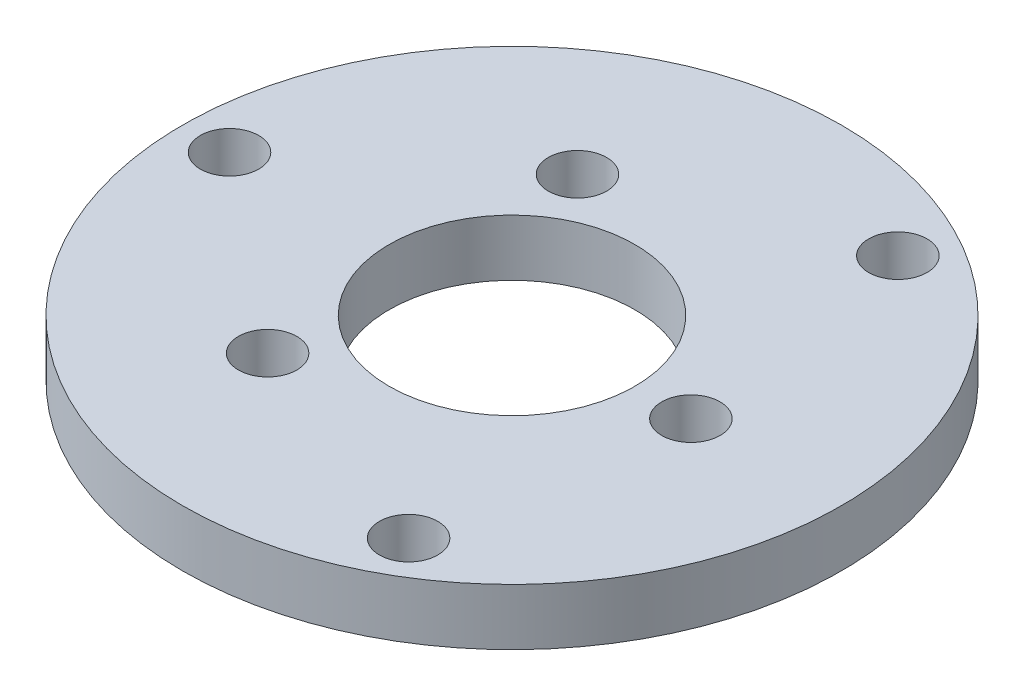
ISO-10303-21;
HEADER;
FILE_DESCRIPTION(('STEP AP214'),'2;1');
FILE_NAME('part.step','',(''),(''),'','','');
FILE_SCHEMA(('AUTOMOTIVE_DESIGN { 1 0 10303 214 1 1 1 1 }'));
ENDSEC;
DATA;
#1=APPLICATION_CONTEXT('core data for automotive mechanical design processes');
#2=APPLICATION_PROTOCOL_DEFINITION('international standard','automotive_design',2000,#1);
#3=PRODUCT_CONTEXT('',#1,'mechanical');
#4=PRODUCT('Part','Part','',(#3));
#5=PRODUCT_RELATED_PRODUCT_CATEGORY('part','',(#4));
#6=PRODUCT_DEFINITION_FORMATION('','',#4);
#7=PRODUCT_DEFINITION_CONTEXT('part definition',#1,'design');
#8=PRODUCT_DEFINITION('design','',#6,#7);
#9=PRODUCT_DEFINITION_SHAPE('','',#8);
#10=(LENGTH_UNIT() NAMED_UNIT(*) SI_UNIT(.MILLI.,.METRE.));
#11=(NAMED_UNIT(*) PLANE_ANGLE_UNIT() SI_UNIT($,.RADIAN.));
#12=(NAMED_UNIT(*) SI_UNIT($,.STERADIAN.) SOLID_ANGLE_UNIT());
#13=UNCERTAINTY_MEASURE_WITH_UNIT(LENGTH_MEASURE(1.E-05),#10,'distance_accuracy_value','');
#14=(GEOMETRIC_REPRESENTATION_CONTEXT(3) GLOBAL_UNCERTAINTY_ASSIGNED_CONTEXT((#13)) GLOBAL_UNIT_ASSIGNED_CONTEXT((#10,
#11,#12)) REPRESENTATION_CONTEXT('',''));
#15=CARTESIAN_POINT('',(0.,0.,0.));
#16=DIRECTION('',(0.,0.,1.));
#17=DIRECTION('',(1.,0.,0.));
#18=AXIS2_PLACEMENT_3D('',#15,#16,#17);
#19=CARTESIAN_POINT('',(0.,3.,0.));
#20=DIRECTION('',(0.,1.,0.));
#21=DIRECTION('',(0.,0.,1.));
#22=AXIS2_PLACEMENT_3D('',#19,#20,#21);
#23=PLANE('',#22);
#24=CARTESIAN_POINT('',(-4.75,3.,8.22724133595217));
#25=DIRECTION('',(0.,1.,0.));
#26=DIRECTION('',(0.,0.,1.));
#27=AXIS2_PLACEMENT_3D('',#24,#25,#26);
#28=CIRCLE('',#27,1.55);
#29=CARTESIAN_POINT('',(-4.75,3.,9.77724133595217));
#30=VERTEX_POINT('',#29);
#31=EDGE_CURVE('E74',#30,#30,#28,.T.);
#32=ORIENTED_EDGE('',*,*,#31,.F.);
#33=EDGE_LOOP('',(#32));
#34=FACE_BOUND('',#33,.T.);
#35=CARTESIAN_POINT('',(7.5,3.,-12.9903810567666));
#36=DIRECTION('',(0.,1.,0.));
#37=DIRECTION('',(0.,0.,1.));
#38=AXIS2_PLACEMENT_3D('',#35,#36,#37);
#39=CIRCLE('',#38,1.55);
#40=CARTESIAN_POINT('',(7.5,3.,-11.4403810567666));
#41=VERTEX_POINT('',#40);
#42=EDGE_CURVE('E62',#41,#41,#39,.T.);
#43=ORIENTED_EDGE('',*,*,#42,.F.);
#44=EDGE_LOOP('',(#43));
#45=FACE_BOUND('',#44,.T.);
#46=CARTESIAN_POINT('',(-15.,3.,0.));
#47=DIRECTION('',(0.,1.,0.));
#48=DIRECTION('',(0.,0.,1.));
#49=AXIS2_PLACEMENT_3D('',#46,#47,#48);
#50=CIRCLE('',#49,1.55);
#51=CARTESIAN_POINT('',(-15.,3.,1.55));
#52=VERTEX_POINT('',#51);
#53=EDGE_CURVE('E50',#52,#52,#50,.T.);
#54=ORIENTED_EDGE('',*,*,#53,.F.);
#55=EDGE_LOOP('',(#54));
#56=FACE_BOUND('',#55,.T.);
#57=CARTESIAN_POINT('',(0.,3.,0.));
#58=DIRECTION('',(0.,1.,0.));
#59=DIRECTION('',(0.,0.,1.));
#60=AXIS2_PLACEMENT_3D('',#57,#58,#59);
#61=CIRCLE('',#60,17.5);
#62=CARTESIAN_POINT('',(0.,3.,17.5));
#63=VERTEX_POINT('',#62);
#64=EDGE_CURVE('E10',#63,#63,#61,.T.);
#65=ORIENTED_EDGE('',*,*,#64,.T.);
#66=EDGE_LOOP('',(#65));
#67=FACE_BOUND('',#66,.T.);
#68=CARTESIAN_POINT('',(0.,3.,0.));
#69=DIRECTION('',(0.,1.,0.));
#70=DIRECTION('',(0.,0.,1.));
#71=AXIS2_PLACEMENT_3D('',#68,#69,#70);
#72=CIRCLE('',#71,6.525);
#73=CARTESIAN_POINT('',(0.,3.,6.525));
#74=VERTEX_POINT('',#73);
#75=EDGE_CURVE('E45',#74,#74,#72,.T.);
#76=ORIENTED_EDGE('',*,*,#75,.F.);
#77=EDGE_LOOP('',(#76));
#78=FACE_BOUND('',#77,.T.);
#79=CARTESIAN_POINT('',(9.5,3.,0.));
#80=DIRECTION('',(0.,1.,0.));
#81=DIRECTION('',(0.,0.,1.));
#82=AXIS2_PLACEMENT_3D('',#79,#80,#81);
#83=CIRCLE('',#82,1.55);
#84=CARTESIAN_POINT('',(9.5,3.,1.55));
#85=VERTEX_POINT('',#84);
#86=EDGE_CURVE('E56',#85,#85,#83,.T.);
#87=ORIENTED_EDGE('',*,*,#86,.F.);
#88=EDGE_LOOP('',(#87));
#89=FACE_BOUND('',#88,.T.);
#90=CARTESIAN_POINT('',(7.50000000000001,3.,12.9903810567666));
#91=DIRECTION('',(0.,1.,0.));
#92=DIRECTION('',(0.,0.,1.));
#93=AXIS2_PLACEMENT_3D('',#90,#91,#92);
#94=CIRCLE('',#93,1.55);
#95=CARTESIAN_POINT('',(7.50000000000001,3.,14.5403810567666));
#96=VERTEX_POINT('',#95);
#97=EDGE_CURVE('E68',#96,#96,#94,.T.);
#98=ORIENTED_EDGE('',*,*,#97,.F.);
#99=EDGE_LOOP('',(#98));
#100=FACE_BOUND('',#99,.T.);
#101=CARTESIAN_POINT('',(-4.75,3.,-8.22724133595217));
#102=DIRECTION('',(0.,1.,0.));
#103=DIRECTION('',(0.,0.,1.));
#104=AXIS2_PLACEMENT_3D('',#101,#102,#103);
#105=CIRCLE('',#104,1.55);
#106=CARTESIAN_POINT('',(-4.75,3.,-6.67724133595217));
#107=VERTEX_POINT('',#106);
#108=EDGE_CURVE('E80',#107,#107,#105,.T.);
#109=ORIENTED_EDGE('',*,*,#108,.F.);
#110=EDGE_LOOP('',(#109));
#111=FACE_BOUND('',#110,.T.);
#112=ADVANCED_FACE('F34',(#34,#45,#56,#67,#78,#89,#100,#111),#23,.T.);
#113=CARTESIAN_POINT('',(0.,0.,0.));
#114=DIRECTION('',(0.,1.,0.));
#115=DIRECTION('',(0.,0.,1.));
#116=AXIS2_PLACEMENT_3D('',#113,#114,#115);
#117=PLANE('',#116);
#118=CARTESIAN_POINT('',(0.,0.,0.));
#119=DIRECTION('',(0.,1.,0.));
#120=DIRECTION('',(0.,0.,1.));
#121=AXIS2_PLACEMENT_3D('',#118,#119,#120);
#122=CIRCLE('',#121,17.5);
#123=CARTESIAN_POINT('',(0.,0.,17.5));
#124=VERTEX_POINT('',#123);
#125=EDGE_CURVE('E38',#124,#124,#122,.T.);
#126=ORIENTED_EDGE('',*,*,#125,.F.);
#127=EDGE_LOOP('',(#126));
#128=FACE_BOUND('',#127,.T.);
#129=CARTESIAN_POINT('',(0.,0.,0.));
#130=DIRECTION('',(0.,1.,0.));
#131=DIRECTION('',(0.,0.,1.));
#132=AXIS2_PLACEMENT_3D('',#129,#130,#131);
#133=CIRCLE('',#132,6.525);
#134=CARTESIAN_POINT('',(0.,0.,6.525));
#135=VERTEX_POINT('',#134);
#136=EDGE_CURVE('E47',#135,#135,#133,.T.);
#137=ORIENTED_EDGE('',*,*,#136,.T.);
#138=EDGE_LOOP('',(#137));
#139=FACE_BOUND('',#138,.T.);
#140=CARTESIAN_POINT('',(-15.,0.,0.));
#141=DIRECTION('',(0.,1.,0.));
#142=DIRECTION('',(0.,0.,1.));
#143=AXIS2_PLACEMENT_3D('',#140,#141,#142);
#144=CIRCLE('',#143,1.55);
#145=CARTESIAN_POINT('',(-15.,0.,1.55));
#146=VERTEX_POINT('',#145);
#147=EDGE_CURVE('E53',#146,#146,#144,.T.);
#148=ORIENTED_EDGE('',*,*,#147,.T.);
#149=EDGE_LOOP('',(#148));
#150=FACE_BOUND('',#149,.T.);
#151=CARTESIAN_POINT('',(9.5,0.,0.));
#152=DIRECTION('',(0.,1.,0.));
#153=DIRECTION('',(0.,0.,1.));
#154=AXIS2_PLACEMENT_3D('',#151,#152,#153);
#155=CIRCLE('',#154,1.55);
#156=CARTESIAN_POINT('',(9.5,0.,1.55));
#157=VERTEX_POINT('',#156);
#158=EDGE_CURVE('E59',#157,#157,#155,.T.);
#159=ORIENTED_EDGE('',*,*,#158,.T.);
#160=EDGE_LOOP('',(#159));
#161=FACE_BOUND('',#160,.T.);
#162=CARTESIAN_POINT('',(7.5,0.,-12.9903810567666));
#163=DIRECTION('',(0.,1.,0.));
#164=DIRECTION('',(0.,0.,1.));
#165=AXIS2_PLACEMENT_3D('',#162,#163,#164);
#166=CIRCLE('',#165,1.55);
#167=CARTESIAN_POINT('',(7.5,0.,-11.4403810567666));
#168=VERTEX_POINT('',#167);
#169=EDGE_CURVE('E65',#168,#168,#166,.T.);
#170=ORIENTED_EDGE('',*,*,#169,.T.);
#171=EDGE_LOOP('',(#170));
#172=FACE_BOUND('',#171,.T.);
#173=CARTESIAN_POINT('',(7.50000000000001,0.,12.9903810567666));
#174=DIRECTION('',(0.,1.,0.));
#175=DIRECTION('',(0.,0.,1.));
#176=AXIS2_PLACEMENT_3D('',#173,#174,#175);
#177=CIRCLE('',#176,1.55);
#178=CARTESIAN_POINT('',(7.50000000000001,0.,14.5403810567666));
#179=VERTEX_POINT('',#178);
#180=EDGE_CURVE('E71',#179,#179,#177,.T.);
#181=ORIENTED_EDGE('',*,*,#180,.T.);
#182=EDGE_LOOP('',(#181));
#183=FACE_BOUND('',#182,.T.);
#184=CARTESIAN_POINT('',(-4.75,0.,8.22724133595217));
#185=DIRECTION('',(0.,1.,0.));
#186=DIRECTION('',(0.,0.,1.));
#187=AXIS2_PLACEMENT_3D('',#184,#185,#186);
#188=CIRCLE('',#187,1.55);
#189=CARTESIAN_POINT('',(-4.75,0.,9.77724133595217));
#190=VERTEX_POINT('',#189);
#191=EDGE_CURVE('E77',#190,#190,#188,.T.);
#192=ORIENTED_EDGE('',*,*,#191,.T.);
#193=EDGE_LOOP('',(#192));
#194=FACE_BOUND('',#193,.T.);
#195=CARTESIAN_POINT('',(-4.75,0.,-8.22724133595217));
#196=DIRECTION('',(0.,1.,0.));
#197=DIRECTION('',(0.,0.,1.));
#198=AXIS2_PLACEMENT_3D('',#195,#196,#197);
#199=CIRCLE('',#198,1.55);
#200=CARTESIAN_POINT('',(-4.75,0.,-6.67724133595217));
#201=VERTEX_POINT('',#200);
#202=EDGE_CURVE('E83',#201,#201,#199,.T.);
#203=ORIENTED_EDGE('',*,*,#202,.T.);
#204=EDGE_LOOP('',(#203));
#205=FACE_BOUND('',#204,.T.);
#206=ADVANCED_FACE('F93',(#128,#139,#150,#161,#172,#183,#194,#205),#117,.F.);
#207=CARTESIAN_POINT('',(0.,3.,0.));
#208=DIRECTION('',(0.,-1.,0.));
#209=DIRECTION('',(0.,0.,-1.));
#210=AXIS2_PLACEMENT_3D('',#207,#208,#209);
#211=CYLINDRICAL_SURFACE('',#210,17.5);
#212=ORIENTED_EDGE('',*,*,#64,.F.);
#213=EDGE_LOOP('',(#212));
#214=FACE_BOUND('',#213,.T.);
#215=ORIENTED_EDGE('',*,*,#125,.T.);
#216=EDGE_LOOP('',(#215));
#217=FACE_BOUND('',#216,.T.);
#218=ADVANCED_FACE('F36',(#214,#217),#211,.T.);
#219=CARTESIAN_POINT('',(0.,3.,0.));
#220=DIRECTION('',(0.,-1.,0.));
#221=DIRECTION('',(0.,0.,-1.));
#222=AXIS2_PLACEMENT_3D('',#219,#220,#221);
#223=CYLINDRICAL_SURFACE('',#222,6.525);
#224=ORIENTED_EDGE('',*,*,#75,.T.);
#225=EDGE_LOOP('',(#224));
#226=FACE_BOUND('',#225,.T.);
#227=ORIENTED_EDGE('',*,*,#136,.F.);
#228=EDGE_LOOP('',(#227));
#229=FACE_BOUND('',#228,.T.);
#230=ADVANCED_FACE('F103',(#226,#229),#223,.F.);
#231=CARTESIAN_POINT('',(-15.,3.,0.));
#232=DIRECTION('',(0.,-1.,0.));
#233=DIRECTION('',(0.,0.,-1.));
#234=AXIS2_PLACEMENT_3D('',#231,#232,#233);
#235=CYLINDRICAL_SURFACE('',#234,1.55);
#236=ORIENTED_EDGE('',*,*,#53,.T.);
#237=EDGE_LOOP('',(#236));
#238=FACE_BOUND('',#237,.T.);
#239=ORIENTED_EDGE('',*,*,#147,.F.);
#240=EDGE_LOOP('',(#239));
#241=FACE_BOUND('',#240,.T.);
#242=ADVANCED_FACE('F106',(#238,#241),#235,.F.);
#243=CARTESIAN_POINT('',(9.5,3.,0.));
#244=DIRECTION('',(0.,-1.,0.));
#245=DIRECTION('',(0.,0.,-1.));
#246=AXIS2_PLACEMENT_3D('',#243,#244,#245);
#247=CYLINDRICAL_SURFACE('',#246,1.55);
#248=ORIENTED_EDGE('',*,*,#86,.T.);
#249=EDGE_LOOP('',(#248));
#250=FACE_BOUND('',#249,.T.);
#251=ORIENTED_EDGE('',*,*,#158,.F.);
#252=EDGE_LOOP('',(#251));
#253=FACE_BOUND('',#252,.T.);
#254=ADVANCED_FACE('F110',(#250,#253),#247,.F.);
#255=CARTESIAN_POINT('',(7.5,3.,-12.9903810567666));
#256=DIRECTION('',(0.,-1.,0.));
#257=DIRECTION('',(0.,0.,-1.));
#258=AXIS2_PLACEMENT_3D('',#255,#256,#257);
#259=CYLINDRICAL_SURFACE('',#258,1.55);
#260=ORIENTED_EDGE('',*,*,#42,.T.);
#261=EDGE_LOOP('',(#260));
#262=FACE_BOUND('',#261,.T.);
#263=ORIENTED_EDGE('',*,*,#169,.F.);
#264=EDGE_LOOP('',(#263));
#265=FACE_BOUND('',#264,.T.);
#266=ADVANCED_FACE('F114',(#262,#265),#259,.F.);
#267=CARTESIAN_POINT('',(7.50000000000001,3.,12.9903810567666));
#268=DIRECTION('',(0.,-1.,0.));
#269=DIRECTION('',(0.,0.,-1.));
#270=AXIS2_PLACEMENT_3D('',#267,#268,#269);
#271=CYLINDRICAL_SURFACE('',#270,1.55);
#272=ORIENTED_EDGE('',*,*,#97,.T.);
#273=EDGE_LOOP('',(#272));
#274=FACE_BOUND('',#273,.T.);
#275=ORIENTED_EDGE('',*,*,#180,.F.);
#276=EDGE_LOOP('',(#275));
#277=FACE_BOUND('',#276,.T.);
#278=ADVANCED_FACE('F118',(#274,#277),#271,.F.);
#279=CARTESIAN_POINT('',(-4.75,3.,8.22724133595217));
#280=DIRECTION('',(0.,-1.,0.));
#281=DIRECTION('',(0.,0.,-1.));
#282=AXIS2_PLACEMENT_3D('',#279,#280,#281);
#283=CYLINDRICAL_SURFACE('',#282,1.55);
#284=ORIENTED_EDGE('',*,*,#31,.T.);
#285=EDGE_LOOP('',(#284));
#286=FACE_BOUND('',#285,.T.);
#287=ORIENTED_EDGE('',*,*,#191,.F.);
#288=EDGE_LOOP('',(#287));
#289=FACE_BOUND('',#288,.T.);
#290=ADVANCED_FACE('F122',(#286,#289),#283,.F.);
#291=CARTESIAN_POINT('',(-4.75,3.,-8.22724133595217));
#292=DIRECTION('',(0.,-1.,0.));
#293=DIRECTION('',(0.,0.,-1.));
#294=AXIS2_PLACEMENT_3D('',#291,#292,#293);
#295=CYLINDRICAL_SURFACE('',#294,1.55);
#296=ORIENTED_EDGE('',*,*,#108,.T.);
#297=EDGE_LOOP('',(#296));
#298=FACE_BOUND('',#297,.T.);
#299=ORIENTED_EDGE('',*,*,#202,.F.);
#300=EDGE_LOOP('',(#299));
#301=FACE_BOUND('',#300,.T.);
#302=ADVANCED_FACE('F89',(#298,#301),#295,.F.);
#303=CLOSED_SHELL('',(#112,#206,#218,#230,#242,#254,#266,#278,#290,#302));
#304=MANIFOLD_SOLID_BREP('B2',#303);
#305=ADVANCED_BREP_SHAPE_REPRESENTATION('',(#18,#304),#14);
#306=SHAPE_DEFINITION_REPRESENTATION(#9,#305);
ENDSEC;
END-ISO-10303-21;
